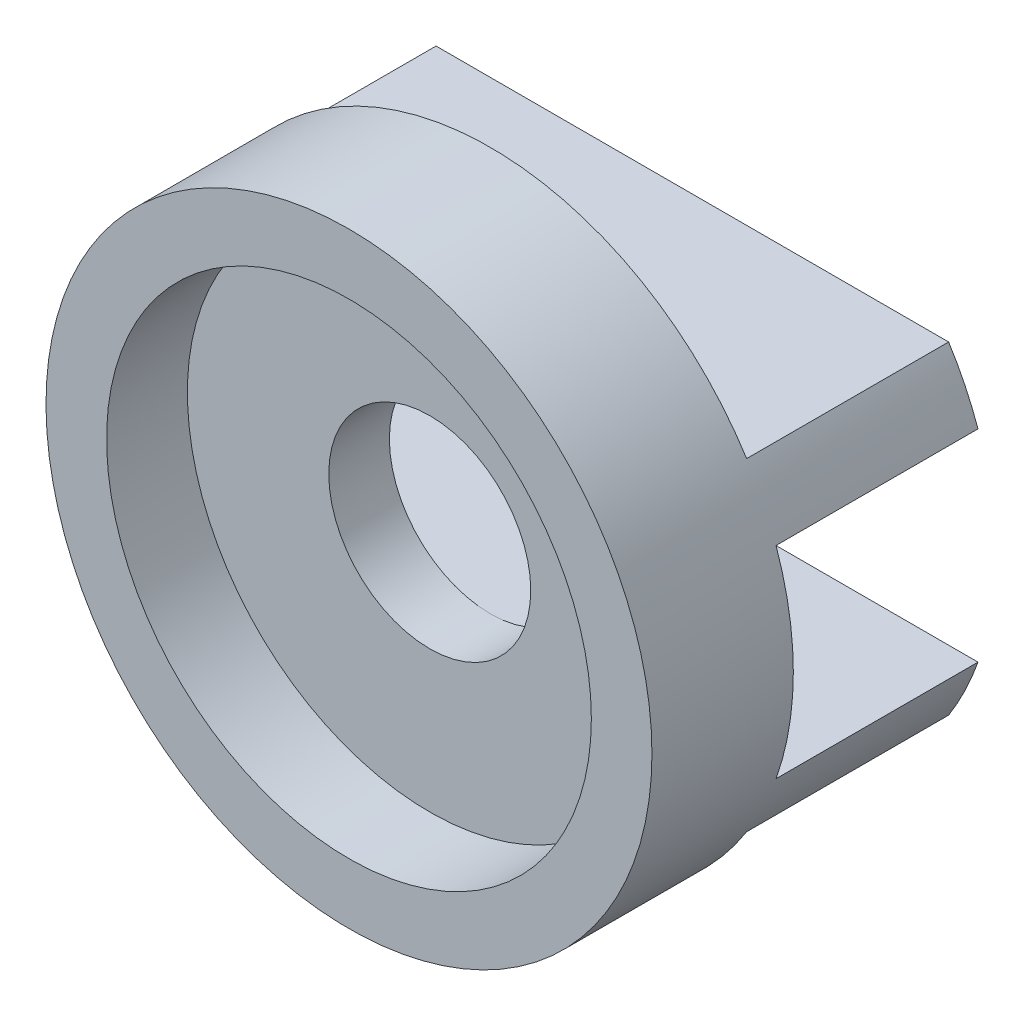
ISO-10303-21;
HEADER;
FILE_DESCRIPTION(('STEP AP214'),'2;1');
FILE_NAME('part.step','',(''),(''),'','','');
FILE_SCHEMA(('AUTOMOTIVE_DESIGN { 1 0 10303 214 1 1 1 1 }'));
ENDSEC;
DATA;
#1=APPLICATION_CONTEXT('core data for automotive mechanical design processes');
#2=APPLICATION_PROTOCOL_DEFINITION('international standard','automotive_design',2000,#1);
#3=PRODUCT_CONTEXT('',#1,'mechanical');
#4=PRODUCT('Part','Part','',(#3));
#5=PRODUCT_RELATED_PRODUCT_CATEGORY('part','',(#4));
#6=PRODUCT_DEFINITION_FORMATION('','',#4);
#7=PRODUCT_DEFINITION_CONTEXT('part definition',#1,'design');
#8=PRODUCT_DEFINITION('design','',#6,#7);
#9=PRODUCT_DEFINITION_SHAPE('','',#8);
#10=(LENGTH_UNIT() NAMED_UNIT(*) SI_UNIT(.MILLI.,.METRE.));
#11=(NAMED_UNIT(*) PLANE_ANGLE_UNIT() SI_UNIT($,.RADIAN.));
#12=(NAMED_UNIT(*) SI_UNIT($,.STERADIAN.) SOLID_ANGLE_UNIT());
#13=UNCERTAINTY_MEASURE_WITH_UNIT(LENGTH_MEASURE(1.E-05),#10,'distance_accuracy_value','');
#14=(GEOMETRIC_REPRESENTATION_CONTEXT(3) GLOBAL_UNCERTAINTY_ASSIGNED_CONTEXT((#13)) GLOBAL_UNIT_ASSIGNED_CONTEXT((#10,
#11,#12)) REPRESENTATION_CONTEXT('',''));
#15=CARTESIAN_POINT('',(0.,0.,0.));
#16=DIRECTION('',(0.,0.,1.));
#17=DIRECTION('',(1.,0.,0.));
#18=AXIS2_PLACEMENT_3D('',#15,#16,#17);
#19=CARTESIAN_POINT('',(0.,0.,0.));
#20=DIRECTION('',(0.,0.,1.));
#21=DIRECTION('',(1.,0.,0.));
#22=AXIS2_PLACEMENT_3D('',#19,#20,#21);
#23=PLANE('',#22);
#24=DIRECTION('',(1.,0.,0.));
#25=VECTOR('',#24,1.);
#26=CARTESIAN_POINT('',(0.,25.,0.));
#27=LINE('',#26,#25);
#28=CARTESIAN_POINT('',(-70.7106781186548,25.,0.));
#29=VERTEX_POINT('',#28);
#30=CARTESIAN_POINT('',(0.,25.,0.));
#31=VERTEX_POINT('',#30);
#32=EDGE_CURVE('E126',#29,#31,#27,.T.);
#33=ORIENTED_EDGE('',*,*,#32,.T.);
#34=CARTESIAN_POINT('',(0.,0.,0.));
#35=DIRECTION('',(0.,0.,1.));
#36=DIRECTION('',(1.,0.,0.));
#37=AXIS2_PLACEMENT_3D('',#34,#35,#36);
#38=CIRCLE('',#37,25.);
#39=CARTESIAN_POINT('',(0.,-25.,0.));
#40=VERTEX_POINT('',#39);
#41=EDGE_CURVE('E56',#31,#40,#38,.T.);
#42=ORIENTED_EDGE('',*,*,#41,.T.);
#43=DIRECTION('',(-1.,0.,0.));
#44=VECTOR('',#43,1.);
#45=CARTESIAN_POINT('',(0.,-25.,0.));
#46=LINE('',#45,#44);
#47=CARTESIAN_POINT('',(-70.7106781186548,-25.,0.));
#48=VERTEX_POINT('',#47);
#49=EDGE_CURVE('E123',#40,#48,#46,.T.);
#50=ORIENTED_EDGE('',*,*,#49,.T.);
#51=CARTESIAN_POINT('',(0.,0.,0.));
#52=DIRECTION('',(0.,0.,1.));
#53=DIRECTION('',(1.,0.,0.));
#54=AXIS2_PLACEMENT_3D('',#51,#52,#53);
#55=CIRCLE('',#54,75.);
#56=EDGE_CURVE('E178',#29,#48,#55,.T.);
#57=ORIENTED_EDGE('',*,*,#56,.F.);
#58=EDGE_LOOP('',(#33,#42,#50,#57));
#59=FACE_BOUND('',#58,.T.);
#60=ADVANCED_FACE('F42',(#59),#23,.F.);
#61=DIRECTION('',(-1.,0.,0.));
#62=VECTOR('',#61,1.);
#63=CARTESIAN_POINT('',(0.,-40.0000000000362,0.));
#64=LINE('',#63,#62);
#65=CARTESIAN_POINT('',(63.4428877022248,-40.0000000000362,0.));
#66=VERTEX_POINT('',#65);
#67=CARTESIAN_POINT('',(-63.4428877022248,-40.0000000000362,0.));
#68=VERTEX_POINT('',#67);
#69=EDGE_CURVE('E142',#66,#68,#64,.T.);
#70=ORIENTED_EDGE('',*,*,#69,.F.);
#71=EDGE_CURVE('E179',#68,#66,#55,.T.);
#72=ORIENTED_EDGE('',*,*,#71,.F.);
#73=EDGE_LOOP('',(#70,#72));
#74=FACE_BOUND('',#73,.T.);
#75=ADVANCED_FACE('F200',(#74),#23,.F.);
#76=CARTESIAN_POINT('',(63.4428877022248,40.0000000000362,0.));
#77=VERTEX_POINT('',#76);
#78=CARTESIAN_POINT('',(-63.4428877022248,40.0000000000362,0.));
#79=VERTEX_POINT('',#78);
#80=EDGE_CURVE('E50',#77,#79,#55,.T.);
#81=ORIENTED_EDGE('',*,*,#80,.F.);
#82=DIRECTION('',(-1.,0.,0.));
#83=VECTOR('',#82,1.);
#84=CARTESIAN_POINT('',(0.,40.0000000000362,0.));
#85=LINE('',#84,#83);
#86=EDGE_CURVE('E155',#77,#79,#85,.T.);
#87=ORIENTED_EDGE('',*,*,#86,.T.);
#88=EDGE_LOOP('',(#81,#87));
#89=FACE_BOUND('',#88,.T.);
#90=ADVANCED_FACE('F198',(#89),#23,.F.);
#91=CARTESIAN_POINT('',(0.,0.,15.));
#92=DIRECTION('',(0.,0.,-1.));
#93=DIRECTION('',(-1.,0.,0.));
#94=AXIS2_PLACEMENT_3D('',#91,#92,#93);
#95=CYLINDRICAL_SURFACE('',#94,75.);
#96=ORIENTED_EDGE('',*,*,#56,.T.);
#97=DIRECTION('',(0.,0.,1.));
#98=VECTOR('',#97,1.);
#99=CARTESIAN_POINT('',(-70.7106781186548,-25.,-50.));
#100=LINE('',#99,#98);
#101=CARTESIAN_POINT('',(-70.7106781186548,-25.,-50.));
#102=VERTEX_POINT('',#101);
#103=EDGE_CURVE('E135',#102,#48,#100,.T.);
#104=ORIENTED_EDGE('',*,*,#103,.F.);
#105=CARTESIAN_POINT('',(0.,0.,-50.));
#106=DIRECTION('',(0.,0.,-1.));
#107=DIRECTION('',(-1.,0.,0.));
#108=AXIS2_PLACEMENT_3D('',#105,#106,#107);
#109=CIRCLE('',#108,75.);
#110=CARTESIAN_POINT('',(-63.4428877022248,-40.0000000000362,-50.));
#111=VERTEX_POINT('',#110);
#112=EDGE_CURVE('E146',#111,#102,#109,.T.);
#113=ORIENTED_EDGE('',*,*,#112,.F.);
#114=DIRECTION('',(0.,0.,1.));
#115=VECTOR('',#114,1.);
#116=CARTESIAN_POINT('',(-63.4428877022248,-40.0000000000362,-50.));
#117=LINE('',#116,#115);
#118=EDGE_CURVE('E64',#111,#68,#117,.T.);
#119=ORIENTED_EDGE('',*,*,#118,.T.);
#120=ORIENTED_EDGE('',*,*,#71,.T.);
#121=DIRECTION('',(0.,0.,1.));
#122=VECTOR('',#121,1.);
#123=CARTESIAN_POINT('',(63.4428877022248,-40.0000000000362,-50.));
#124=LINE('',#123,#122);
#125=CARTESIAN_POINT('',(63.4428877022248,-40.0000000000362,-50.));
#126=VERTEX_POINT('',#125);
#127=EDGE_CURVE('E151',#126,#66,#124,.T.);
#128=ORIENTED_EDGE('',*,*,#127,.F.);
#129=CARTESIAN_POINT('',(0.,0.,-50.));
#130=DIRECTION('',(0.,0.,-1.));
#131=DIRECTION('',(-1.,0.,0.));
#132=AXIS2_PLACEMENT_3D('',#129,#130,#131);
#133=CIRCLE('',#132,75.);
#134=CARTESIAN_POINT('',(70.7106781186548,-25.,-50.));
#135=VERTEX_POINT('',#134);
#136=EDGE_CURVE('E386',#135,#126,#133,.T.);
#137=ORIENTED_EDGE('',*,*,#136,.F.);
#138=DIRECTION('',(0.,0.,1.));
#139=VECTOR('',#138,1.);
#140=CARTESIAN_POINT('',(70.7106781186548,-25.,-50.));
#141=LINE('',#140,#139);
#142=CARTESIAN_POINT('',(70.7106781186548,-25.,0.));
#143=VERTEX_POINT('',#142);
#144=EDGE_CURVE('E153',#135,#143,#141,.T.);
#145=ORIENTED_EDGE('',*,*,#144,.T.);
#146=CARTESIAN_POINT('',(70.7106781186548,25.,0.));
#147=VERTEX_POINT('',#146);
#148=EDGE_CURVE('E141',#143,#147,#55,.T.);
#149=ORIENTED_EDGE('',*,*,#148,.T.);
#150=DIRECTION('',(0.,0.,1.));
#151=VECTOR('',#150,1.);
#152=CARTESIAN_POINT('',(70.7106781186548,25.,-50.));
#153=LINE('',#152,#151);
#154=CARTESIAN_POINT('',(70.7106781186548,25.,-50.));
#155=VERTEX_POINT('',#154);
#156=EDGE_CURVE('E174',#155,#147,#153,.T.);
#157=ORIENTED_EDGE('',*,*,#156,.F.);
#158=CARTESIAN_POINT('',(0.,0.,-50.));
#159=DIRECTION('',(0.,0.,-1.));
#160=DIRECTION('',(-1.,0.,0.));
#161=AXIS2_PLACEMENT_3D('',#158,#159,#160);
#162=CIRCLE('',#161,75.);
#163=CARTESIAN_POINT('',(63.4428877022248,40.0000000000362,-50.));
#164=VERTEX_POINT('',#163);
#165=EDGE_CURVE('E159',#164,#155,#162,.T.);
#166=ORIENTED_EDGE('',*,*,#165,.F.);
#167=DIRECTION('',(0.,0.,1.));
#168=VECTOR('',#167,1.);
#169=CARTESIAN_POINT('',(63.4428877022248,40.0000000000362,-50.));
#170=LINE('',#169,#168);
#171=EDGE_CURVE('E177',#164,#77,#170,.T.);
#172=ORIENTED_EDGE('',*,*,#171,.T.);
#173=ORIENTED_EDGE('',*,*,#80,.T.);
#174=DIRECTION('',(0.,0.,1.));
#175=VECTOR('',#174,1.);
#176=CARTESIAN_POINT('',(-63.4428877022248,40.0000000000362,-50.));
#177=LINE('',#176,#175);
#178=CARTESIAN_POINT('',(-63.4428877022248,40.0000000000362,-50.));
#179=VERTEX_POINT('',#178);
#180=EDGE_CURVE('E166',#179,#79,#177,.T.);
#181=ORIENTED_EDGE('',*,*,#180,.F.);
#182=CARTESIAN_POINT('',(0.,0.,-50.));
#183=DIRECTION('',(0.,0.,-1.));
#184=DIRECTION('',(-1.,0.,0.));
#185=AXIS2_PLACEMENT_3D('',#182,#183,#184);
#186=CIRCLE('',#185,75.);
#187=CARTESIAN_POINT('',(-70.7106781186548,25.,-50.));
#188=VERTEX_POINT('',#187);
#189=EDGE_CURVE('E164',#188,#179,#186,.T.);
#190=ORIENTED_EDGE('',*,*,#189,.F.);
#191=DIRECTION('',(0.,0.,1.));
#192=VECTOR('',#191,1.);
#193=CARTESIAN_POINT('',(-70.7106781186548,25.,-50.));
#194=LINE('',#193,#192);
#195=EDGE_CURVE('E172',#188,#29,#194,.T.);
#196=ORIENTED_EDGE('',*,*,#195,.T.);
#197=EDGE_LOOP('',(#96,#104,#113,#119,#120,#128,#137,#145,#149,#157,#166,#172,#173,#181,#190,#196));
#198=FACE_BOUND('',#197,.T.);
#199=CARTESIAN_POINT('',(0.,0.,35.));
#200=DIRECTION('',(0.,0.,1.));
#201=DIRECTION('',(1.,0.,0.));
#202=AXIS2_PLACEMENT_3D('',#199,#200,#201);
#203=CIRCLE('',#202,75.);
#204=CARTESIAN_POINT('',(75.,0.,35.));
#205=VERTEX_POINT('',#204);
#206=EDGE_CURVE('E137',#205,#205,#203,.T.);
#207=ORIENTED_EDGE('',*,*,#206,.F.);
#208=EDGE_LOOP('',(#207));
#209=FACE_BOUND('',#208,.T.);
#210=ADVANCED_FACE('F44',(#198,#209),#95,.T.);
#211=EDGE_CURVE('E131',#143,#40,#46,.T.);
#212=ORIENTED_EDGE('',*,*,#211,.T.);
#213=EDGE_CURVE('E112',#40,#31,#38,.T.);
#214=ORIENTED_EDGE('',*,*,#213,.T.);
#215=EDGE_CURVE('E169',#31,#147,#27,.T.);
#216=ORIENTED_EDGE('',*,*,#215,.T.);
#217=ORIENTED_EDGE('',*,*,#148,.F.);
#218=EDGE_LOOP('',(#212,#214,#216,#217));
#219=FACE_BOUND('',#218,.T.);
#220=ADVANCED_FACE('F139',(#219),#23,.F.);
#221=CARTESIAN_POINT('',(0.,40.0000000000362,-50.));
#222=DIRECTION('',(0.,1.,0.));
#223=DIRECTION('',(0.,0.,1.));
#224=AXIS2_PLACEMENT_3D('',#221,#222,#223);
#225=PLANE('',#224);
#226=ORIENTED_EDGE('',*,*,#86,.F.);
#227=ORIENTED_EDGE('',*,*,#171,.F.);
#228=DIRECTION('',(-1.,0.,0.));
#229=VECTOR('',#228,1.);
#230=CARTESIAN_POINT('',(0.,40.0000000000362,-50.));
#231=LINE('',#230,#229);
#232=EDGE_CURVE('E156',#164,#179,#231,.T.);
#233=ORIENTED_EDGE('',*,*,#232,.T.);
#234=ORIENTED_EDGE('',*,*,#180,.T.);
#235=EDGE_LOOP('',(#226,#227,#233,#234));
#236=FACE_BOUND('',#235,.T.);
#237=ADVANCED_FACE('F196',(#236),#225,.T.);
#238=CARTESIAN_POINT('',(0.,25.,-50.));
#239=DIRECTION('',(0.,-1.,0.));
#240=DIRECTION('',(0.,0.,-1.));
#241=AXIS2_PLACEMENT_3D('',#238,#239,#240);
#242=PLANE('',#241);
#243=ORIENTED_EDGE('',*,*,#215,.F.);
#244=ORIENTED_EDGE('',*,*,#32,.F.);
#245=ORIENTED_EDGE('',*,*,#195,.F.);
#246=DIRECTION('',(1.,0.,0.));
#247=VECTOR('',#246,1.);
#248=CARTESIAN_POINT('',(0.,25.,-50.));
#249=LINE('',#248,#247);
#250=EDGE_CURVE('E161',#188,#155,#249,.T.);
#251=ORIENTED_EDGE('',*,*,#250,.T.);
#252=ORIENTED_EDGE('',*,*,#156,.T.);
#253=EDGE_LOOP('',(#243,#244,#245,#251,#252));
#254=FACE_BOUND('',#253,.T.);
#255=ADVANCED_FACE('F186',(#254),#242,.T.);
#256=CARTESIAN_POINT('',(0.,0.,-50.));
#257=DIRECTION('',(0.,0.,-1.));
#258=DIRECTION('',(-1.,0.,0.));
#259=AXIS2_PLACEMENT_3D('',#256,#257,#258);
#260=PLANE('',#259);
#261=ORIENTED_EDGE('',*,*,#232,.F.);
#262=ORIENTED_EDGE('',*,*,#165,.T.);
#263=ORIENTED_EDGE('',*,*,#250,.F.);
#264=ORIENTED_EDGE('',*,*,#189,.T.);
#265=EDGE_LOOP('',(#261,#262,#263,#264));
#266=FACE_BOUND('',#265,.T.);
#267=ADVANCED_FACE('F191',(#266),#260,.T.);
#268=CARTESIAN_POINT('',(0.,-25.,-50.));
#269=DIRECTION('',(0.,1.,0.));
#270=DIRECTION('',(0.,0.,1.));
#271=AXIS2_PLACEMENT_3D('',#268,#269,#270);
#272=PLANE('',#271);
#273=ORIENTED_EDGE('',*,*,#49,.F.);
#274=ORIENTED_EDGE('',*,*,#211,.F.);
#275=ORIENTED_EDGE('',*,*,#144,.F.);
#276=DIRECTION('',(-1.,0.,0.));
#277=VECTOR('',#276,1.);
#278=CARTESIAN_POINT('',(0.,-25.,-50.));
#279=LINE('',#278,#277);
#280=EDGE_CURVE('E143',#135,#102,#279,.T.);
#281=ORIENTED_EDGE('',*,*,#280,.T.);
#282=ORIENTED_EDGE('',*,*,#103,.T.);
#283=EDGE_LOOP('',(#273,#274,#275,#281,#282));
#284=FACE_BOUND('',#283,.T.);
#285=ADVANCED_FACE('F130',(#284),#272,.T.);
#286=CARTESIAN_POINT('',(0.,-40.0000000000362,-50.));
#287=DIRECTION('',(0.,1.,0.));
#288=DIRECTION('',(0.,0.,1.));
#289=AXIS2_PLACEMENT_3D('',#286,#287,#288);
#290=PLANE('',#289);
#291=ORIENTED_EDGE('',*,*,#69,.T.);
#292=ORIENTED_EDGE('',*,*,#118,.F.);
#293=DIRECTION('',(-1.,0.,0.));
#294=VECTOR('',#293,1.);
#295=CARTESIAN_POINT('',(0.,-40.0000000000362,-50.));
#296=LINE('',#295,#294);
#297=EDGE_CURVE('E387',#126,#111,#296,.T.);
#298=ORIENTED_EDGE('',*,*,#297,.F.);
#299=ORIENTED_EDGE('',*,*,#127,.T.);
#300=EDGE_LOOP('',(#291,#292,#298,#299));
#301=FACE_BOUND('',#300,.T.);
#302=ADVANCED_FACE('F253',(#301),#290,.F.);
#303=CARTESIAN_POINT('',(0.,0.,-50.));
#304=DIRECTION('',(0.,0.,-1.));
#305=DIRECTION('',(-1.,0.,0.));
#306=AXIS2_PLACEMENT_3D('',#303,#304,#305);
#307=PLANE('',#306);
#308=ORIENTED_EDGE('',*,*,#280,.F.);
#309=ORIENTED_EDGE('',*,*,#136,.T.);
#310=ORIENTED_EDGE('',*,*,#297,.T.);
#311=ORIENTED_EDGE('',*,*,#112,.T.);
#312=EDGE_LOOP('',(#308,#309,#310,#311));
#313=FACE_BOUND('',#312,.T.);
#314=ADVANCED_FACE('F259',(#313),#307,.T.);
#315=CARTESIAN_POINT('',(0.,0.,35.));
#316=DIRECTION('',(0.,0.,1.));
#317=DIRECTION('',(1.,0.,0.));
#318=AXIS2_PLACEMENT_3D('',#315,#316,#317);
#319=PLANE('',#318);
#320=ORIENTED_EDGE('',*,*,#206,.T.);
#321=EDGE_LOOP('',(#320));
#322=FACE_BOUND('',#321,.T.);
#323=CARTESIAN_POINT('',(0.,0.,35.));
#324=DIRECTION('',(0.,0.,1.));
#325=DIRECTION('',(1.,0.,0.));
#326=AXIS2_PLACEMENT_3D('',#323,#324,#325);
#327=CIRCLE('',#326,60.);
#328=CARTESIAN_POINT('',(60.,0.,35.));
#329=VERTEX_POINT('',#328);
#330=EDGE_CURVE('E127',#329,#329,#327,.T.);
#331=ORIENTED_EDGE('',*,*,#330,.F.);
#332=EDGE_LOOP('',(#331));
#333=FACE_BOUND('',#332,.T.);
#334=ADVANCED_FACE('F272',(#322,#333),#319,.T.);
#335=CARTESIAN_POINT('',(0.,0.,35.));
#336=DIRECTION('',(0.,0.,-1.));
#337=DIRECTION('',(-1.,0.,0.));
#338=AXIS2_PLACEMENT_3D('',#335,#336,#337);
#339=CYLINDRICAL_SURFACE('',#338,60.);
#340=ORIENTED_EDGE('',*,*,#330,.T.);
#341=EDGE_LOOP('',(#340));
#342=FACE_BOUND('',#341,.T.);
#343=CARTESIAN_POINT('',(0.,0.,15.));
#344=DIRECTION('',(0.,0.,1.));
#345=DIRECTION('',(1.,0.,0.));
#346=AXIS2_PLACEMENT_3D('',#343,#344,#345);
#347=CIRCLE('',#346,60.);
#348=CARTESIAN_POINT('',(60.,0.,15.));
#349=VERTEX_POINT('',#348);
#350=EDGE_CURVE('E11',#349,#349,#347,.F.);
#351=ORIENTED_EDGE('',*,*,#350,.T.);
#352=EDGE_LOOP('',(#351));
#353=FACE_BOUND('',#352,.T.);
#354=ADVANCED_FACE('F288',(#342,#353),#339,.F.);
#355=CARTESIAN_POINT('',(0.,0.,15.));
#356=DIRECTION('',(0.,0.,1.));
#357=DIRECTION('',(1.,0.,0.));
#358=AXIS2_PLACEMENT_3D('',#355,#356,#357);
#359=PLANE('',#358);
#360=CARTESIAN_POINT('',(0.,0.,15.));
#361=DIRECTION('',(0.,0.,1.));
#362=DIRECTION('',(1.,0.,0.));
#363=AXIS2_PLACEMENT_3D('',#360,#361,#362);
#364=CIRCLE('',#363,25.);
#365=CARTESIAN_POINT('',(25.,0.,15.));
#366=VERTEX_POINT('',#365);
#367=EDGE_CURVE('E117',#366,#366,#364,.T.);
#368=ORIENTED_EDGE('',*,*,#367,.F.);
#369=EDGE_LOOP('',(#368));
#370=FACE_BOUND('',#369,.T.);
#371=ORIENTED_EDGE('',*,*,#350,.F.);
#372=EDGE_LOOP('',(#371));
#373=FACE_BOUND('',#372,.T.);
#374=ADVANCED_FACE('F297',(#370,#373),#359,.T.);
#375=CARTESIAN_POINT('',(0.,0.,-5.));
#376=DIRECTION('',(0.,0.,1.));
#377=DIRECTION('',(1.,0.,0.));
#378=AXIS2_PLACEMENT_3D('',#375,#376,#377);
#379=CYLINDRICAL_SURFACE('',#378,25.);
#380=ORIENTED_EDGE('',*,*,#367,.T.);
#381=EDGE_LOOP('',(#380));
#382=FACE_BOUND('',#381,.T.);
#383=ORIENTED_EDGE('',*,*,#213,.F.);
#384=ORIENTED_EDGE('',*,*,#41,.F.);
#385=EDGE_LOOP('',(#383,#384));
#386=FACE_BOUND('',#385,.T.);
#387=ADVANCED_FACE('F113',(#382,#386),#379,.F.);
#388=CLOSED_SHELL('',(#60,#75,#90,#210,#220,#237,#255,#267,#285,#302,#314,#334,#354,#374,#387));
#389=MANIFOLD_SOLID_BREP('B2',#388);
#390=ADVANCED_BREP_SHAPE_REPRESENTATION('',(#18,#389),#14);
#391=SHAPE_DEFINITION_REPRESENTATION(#9,#390);
ENDSEC;
END-ISO-10303-21;
